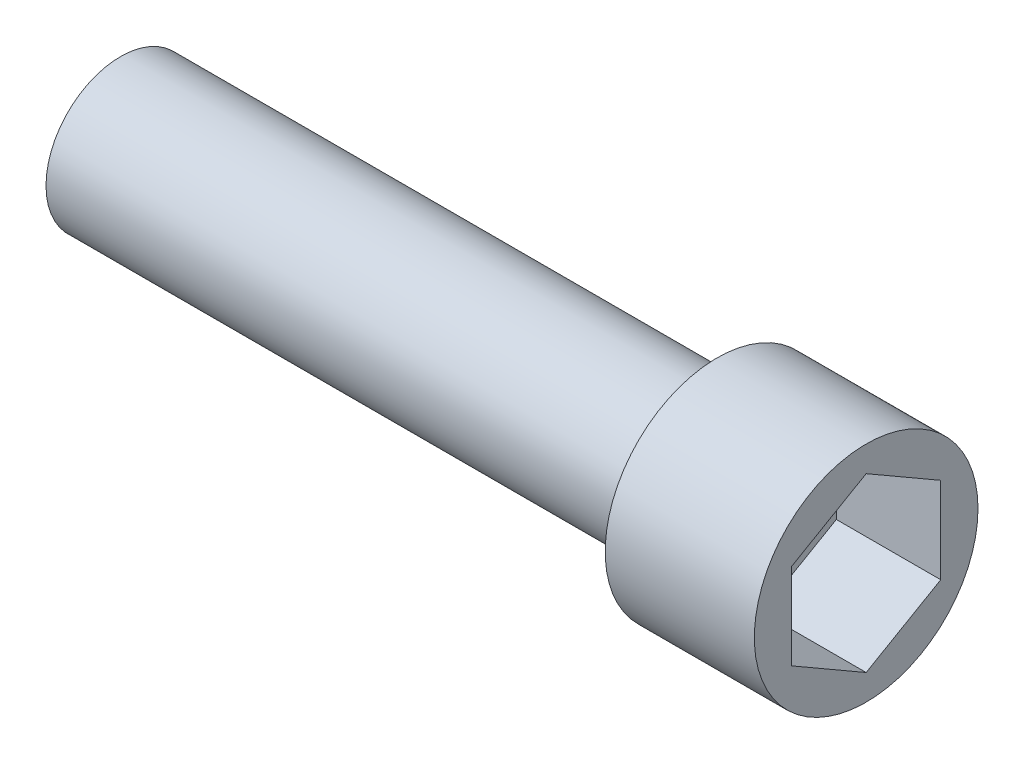
ISO-10303-21;
HEADER;
FILE_DESCRIPTION(('STEP AP214'),'2;1');
FILE_NAME('part.step','',(''),(''),'','','');
FILE_SCHEMA(('AUTOMOTIVE_DESIGN { 1 0 10303 214 1 1 1 1 }'));
ENDSEC;
DATA;
#1=APPLICATION_CONTEXT('core data for automotive mechanical design processes');
#2=APPLICATION_PROTOCOL_DEFINITION('international standard','automotive_design',2000,#1);
#3=PRODUCT_CONTEXT('',#1,'mechanical');
#4=PRODUCT('Part','Part','',(#3));
#5=PRODUCT_RELATED_PRODUCT_CATEGORY('part','',(#4));
#6=PRODUCT_DEFINITION_FORMATION('','',#4);
#7=PRODUCT_DEFINITION_CONTEXT('part definition',#1,'design');
#8=PRODUCT_DEFINITION('design','',#6,#7);
#9=PRODUCT_DEFINITION_SHAPE('','',#8);
#10=(LENGTH_UNIT() NAMED_UNIT(*) SI_UNIT(.MILLI.,.METRE.));
#11=(NAMED_UNIT(*) PLANE_ANGLE_UNIT() SI_UNIT($,.RADIAN.));
#12=(NAMED_UNIT(*) SI_UNIT($,.STERADIAN.) SOLID_ANGLE_UNIT());
#13=UNCERTAINTY_MEASURE_WITH_UNIT(LENGTH_MEASURE(1.E-05),#10,'distance_accuracy_value','');
#14=(GEOMETRIC_REPRESENTATION_CONTEXT(3) GLOBAL_UNCERTAINTY_ASSIGNED_CONTEXT((#13)) GLOBAL_UNIT_ASSIGNED_CONTEXT((#10,
#11,#12)) REPRESENTATION_CONTEXT('',''));
#15=CARTESIAN_POINT('',(0.,0.,0.));
#16=DIRECTION('',(0.,0.,1.));
#17=DIRECTION('',(1.,0.,0.));
#18=AXIS2_PLACEMENT_3D('',#15,#16,#17);
#19=CARTESIAN_POINT('',(10.,0.,0.));
#20=DIRECTION('',(-1.,0.,0.));
#21=DIRECTION('',(0.,0.,1.));
#22=AXIS2_PLACEMENT_3D('',#19,#20,#21);
#23=CYLINDRICAL_SURFACE('',#22,7.5);
#24=CARTESIAN_POINT('',(10.,0.,0.));
#25=DIRECTION('',(1.,0.,0.));
#26=DIRECTION('',(0.,0.,-1.));
#27=AXIS2_PLACEMENT_3D('',#24,#25,#26);
#28=CIRCLE('',#27,7.5);
#29=CARTESIAN_POINT('',(10.,0.,-7.5));
#30=VERTEX_POINT('',#29);
#31=EDGE_CURVE('E54',#30,#30,#28,.T.);
#32=ORIENTED_EDGE('',*,*,#31,.F.);
#33=EDGE_LOOP('',(#32));
#34=FACE_BOUND('',#33,.T.);
#35=CARTESIAN_POINT('',(0.,0.,0.));
#36=DIRECTION('',(1.,0.,0.));
#37=DIRECTION('',(0.,0.,-1.));
#38=AXIS2_PLACEMENT_3D('',#35,#36,#37);
#39=CIRCLE('',#38,7.5);
#40=CARTESIAN_POINT('',(0.,0.,-7.5));
#41=VERTEX_POINT('',#40);
#42=EDGE_CURVE('E48',#41,#41,#39,.T.);
#43=ORIENTED_EDGE('',*,*,#42,.T.);
#44=EDGE_LOOP('',(#43));
#45=FACE_BOUND('',#44,.T.);
#46=ADVANCED_FACE('F45',(#34,#45),#23,.T.);
#47=CARTESIAN_POINT('',(10.,0.,0.));
#48=DIRECTION('',(1.,0.,0.));
#49=DIRECTION('',(0.,0.,-1.));
#50=AXIS2_PLACEMENT_3D('',#47,#48,#49);
#51=PLANE('',#50);
#52=DIRECTION('',(0.,1.,0.));
#53=VECTOR('',#52,1.);
#54=CARTESIAN_POINT('',(10.,-2.88675134594813,-5.));
#55=LINE('',#54,#53);
#56=CARTESIAN_POINT('',(10.,-2.88675134594813,-5.));
#57=VERTEX_POINT('',#56);
#58=CARTESIAN_POINT('',(10.,2.88675134594813,-5.));
#59=VERTEX_POINT('',#58);
#60=EDGE_CURVE('E62',#57,#59,#55,.T.);
#61=ORIENTED_EDGE('',*,*,#60,.F.);
#62=DIRECTION('',(0.,0.5,-0.866025403784439));
#63=VECTOR('',#62,1.);
#64=CARTESIAN_POINT('',(10.,-5.77350269189626,0.));
#65=LINE('',#64,#63);
#66=CARTESIAN_POINT('',(10.,-5.77350269189626,0.));
#67=VERTEX_POINT('',#66);
#68=EDGE_CURVE('E156',#67,#57,#65,.T.);
#69=ORIENTED_EDGE('',*,*,#68,.F.);
#70=DIRECTION('',(0.,-0.5,-0.866025403784438));
#71=VECTOR('',#70,1.);
#72=CARTESIAN_POINT('',(10.,-2.88675134594813,5.));
#73=LINE('',#72,#71);
#74=CARTESIAN_POINT('',(10.,-2.88675134594813,5.));
#75=VERTEX_POINT('',#74);
#76=EDGE_CURVE('E153',#75,#67,#73,.T.);
#77=ORIENTED_EDGE('',*,*,#76,.F.);
#78=DIRECTION('',(0.,-1.,0.));
#79=VECTOR('',#78,1.);
#80=CARTESIAN_POINT('',(10.,2.88675134594813,5.));
#81=LINE('',#80,#79);
#82=CARTESIAN_POINT('',(10.,2.88675134594813,5.));
#83=VERTEX_POINT('',#82);
#84=EDGE_CURVE('E110',#83,#75,#81,.T.);
#85=ORIENTED_EDGE('',*,*,#84,.F.);
#86=DIRECTION('',(0.,-0.5,0.866025403784439));
#87=VECTOR('',#86,1.);
#88=CARTESIAN_POINT('',(10.,5.77350269189626,0.));
#89=LINE('',#88,#87);
#90=CARTESIAN_POINT('',(10.,5.77350269189626,0.));
#91=VERTEX_POINT('',#90);
#92=EDGE_CURVE('E147',#91,#83,#89,.T.);
#93=ORIENTED_EDGE('',*,*,#92,.F.);
#94=DIRECTION('',(0.,0.5,0.866025403784438));
#95=VECTOR('',#94,1.);
#96=CARTESIAN_POINT('',(10.,2.88675134594813,-5.));
#97=LINE('',#96,#95);
#98=EDGE_CURVE('E142',#59,#91,#97,.T.);
#99=ORIENTED_EDGE('',*,*,#98,.F.);
#100=EDGE_LOOP('',(#61,#69,#77,#85,#93,#99));
#101=FACE_BOUND('',#100,.T.);
#102=ORIENTED_EDGE('',*,*,#31,.T.);
#103=EDGE_LOOP('',(#102));
#104=FACE_BOUND('',#103,.T.);
#105=ADVANCED_FACE('F182',(#101,#104),#51,.T.);
#106=CARTESIAN_POINT('',(0.,0.,0.));
#107=DIRECTION('',(1.,0.,0.));
#108=DIRECTION('',(0.,0.,-1.));
#109=AXIS2_PLACEMENT_3D('',#106,#107,#108);
#110=PLANE('',#109);
#111=CARTESIAN_POINT('',(0.,0.,0.));
#112=DIRECTION('',(-1.,0.,0.));
#113=DIRECTION('',(0.,0.,1.));
#114=AXIS2_PLACEMENT_3D('',#111,#112,#113);
#115=CIRCLE('',#114,5.);
#116=CARTESIAN_POINT('',(0.,0.,5.));
#117=VERTEX_POINT('',#116);
#118=EDGE_CURVE('E11',#117,#117,#115,.T.);
#119=ORIENTED_EDGE('',*,*,#118,.F.);
#120=EDGE_LOOP('',(#119));
#121=FACE_BOUND('',#120,.T.);
#122=ORIENTED_EDGE('',*,*,#42,.F.);
#123=EDGE_LOOP('',(#122));
#124=FACE_BOUND('',#123,.T.);
#125=ADVANCED_FACE('F179',(#121,#124),#110,.F.);
#126=CARTESIAN_POINT('',(3.,-2.88675134594813,-5.));
#127=DIRECTION('',(0.,0.,-1.));
#128=DIRECTION('',(-1.,0.,0.));
#129=AXIS2_PLACEMENT_3D('',#126,#127,#128);
#130=PLANE('',#129);
#131=ORIENTED_EDGE('',*,*,#60,.T.);
#132=DIRECTION('',(1.,0.,0.));
#133=VECTOR('',#132,1.);
#134=CARTESIAN_POINT('',(3.,2.88675134594813,-5.));
#135=LINE('',#134,#133);
#136=CARTESIAN_POINT('',(3.,2.88675134594813,-5.));
#137=VERTEX_POINT('',#136);
#138=EDGE_CURVE('E92',#137,#59,#135,.T.);
#139=ORIENTED_EDGE('',*,*,#138,.F.);
#140=DIRECTION('',(0.,1.,0.));
#141=VECTOR('',#140,1.);
#142=CARTESIAN_POINT('',(3.,-2.88675134594813,-5.));
#143=LINE('',#142,#141);
#144=CARTESIAN_POINT('',(3.,-2.88675134594813,-5.));
#145=VERTEX_POINT('',#144);
#146=EDGE_CURVE('E159',#145,#137,#143,.T.);
#147=ORIENTED_EDGE('',*,*,#146,.F.);
#148=DIRECTION('',(1.,0.,0.));
#149=VECTOR('',#148,1.);
#150=CARTESIAN_POINT('',(3.,-2.88675134594813,-5.));
#151=LINE('',#150,#149);
#152=EDGE_CURVE('E70',#145,#57,#151,.T.);
#153=ORIENTED_EDGE('',*,*,#152,.T.);
#154=EDGE_LOOP('',(#131,#139,#147,#153));
#155=FACE_BOUND('',#154,.T.);
#156=ADVANCED_FACE('F181',(#155),#130,.F.);
#157=CARTESIAN_POINT('',(3.,-5.77350269189626,0.));
#158=DIRECTION('',(0.,-0.866025403784439,-0.5));
#159=DIRECTION('',(0.,0.5,-0.866025403784439));
#160=AXIS2_PLACEMENT_3D('',#157,#158,#159);
#161=PLANE('',#160);
#162=ORIENTED_EDGE('',*,*,#68,.T.);
#163=ORIENTED_EDGE('',*,*,#152,.F.);
#164=DIRECTION('',(0.,0.5,-0.866025403784439));
#165=VECTOR('',#164,1.);
#166=CARTESIAN_POINT('',(3.,-5.77350269189626,0.));
#167=LINE('',#166,#165);
#168=CARTESIAN_POINT('',(3.,-5.77350269189626,0.));
#169=VERTEX_POINT('',#168);
#170=EDGE_CURVE('E124',#169,#145,#167,.T.);
#171=ORIENTED_EDGE('',*,*,#170,.F.);
#172=DIRECTION('',(1.,0.,0.));
#173=VECTOR('',#172,1.);
#174=CARTESIAN_POINT('',(3.,-5.77350269189626,0.));
#175=LINE('',#174,#173);
#176=EDGE_CURVE('E115',#169,#67,#175,.T.);
#177=ORIENTED_EDGE('',*,*,#176,.T.);
#178=EDGE_LOOP('',(#162,#163,#171,#177));
#179=FACE_BOUND('',#178,.T.);
#180=ADVANCED_FACE('F189',(#179),#161,.F.);
#181=CARTESIAN_POINT('',(3.,-2.88675134594813,5.));
#182=DIRECTION('',(0.,-0.866025403784438,0.5));
#183=DIRECTION('',(0.,-0.5,-0.866025403784439));
#184=AXIS2_PLACEMENT_3D('',#181,#182,#183);
#185=PLANE('',#184);
#186=ORIENTED_EDGE('',*,*,#76,.T.);
#187=ORIENTED_EDGE('',*,*,#176,.F.);
#188=DIRECTION('',(0.,-0.5,-0.866025403784438));
#189=VECTOR('',#188,1.);
#190=CARTESIAN_POINT('',(3.,-2.88675134594813,5.));
#191=LINE('',#190,#189);
#192=CARTESIAN_POINT('',(3.,-2.88675134594813,5.));
#193=VERTEX_POINT('',#192);
#194=EDGE_CURVE('E119',#193,#169,#191,.T.);
#195=ORIENTED_EDGE('',*,*,#194,.F.);
#196=DIRECTION('',(1.,0.,0.));
#197=VECTOR('',#196,1.);
#198=CARTESIAN_POINT('',(3.,-2.88675134594813,5.));
#199=LINE('',#198,#197);
#200=EDGE_CURVE('E103',#193,#75,#199,.T.);
#201=ORIENTED_EDGE('',*,*,#200,.T.);
#202=EDGE_LOOP('',(#186,#187,#195,#201));
#203=FACE_BOUND('',#202,.T.);
#204=ADVANCED_FACE('F120',(#203),#185,.F.);
#205=CARTESIAN_POINT('',(3.,2.88675134594813,5.));
#206=DIRECTION('',(0.,0.,1.));
#207=DIRECTION('',(1.,0.,0.));
#208=AXIS2_PLACEMENT_3D('',#205,#206,#207);
#209=PLANE('',#208);
#210=ORIENTED_EDGE('',*,*,#84,.T.);
#211=ORIENTED_EDGE('',*,*,#200,.F.);
#212=DIRECTION('',(0.,-1.,0.));
#213=VECTOR('',#212,1.);
#214=CARTESIAN_POINT('',(3.,2.88675134594813,5.));
#215=LINE('',#214,#213);
#216=CARTESIAN_POINT('',(3.,2.88675134594813,5.));
#217=VERTEX_POINT('',#216);
#218=EDGE_CURVE('E107',#217,#193,#215,.T.);
#219=ORIENTED_EDGE('',*,*,#218,.F.);
#220=DIRECTION('',(1.,0.,0.));
#221=VECTOR('',#220,1.);
#222=CARTESIAN_POINT('',(3.,2.88675134594813,5.));
#223=LINE('',#222,#221);
#224=EDGE_CURVE('E116',#217,#83,#223,.T.);
#225=ORIENTED_EDGE('',*,*,#224,.T.);
#226=EDGE_LOOP('',(#210,#211,#219,#225));
#227=FACE_BOUND('',#226,.T.);
#228=ADVANCED_FACE('F105',(#227),#209,.F.);
#229=CARTESIAN_POINT('',(3.,5.77350269189626,0.));
#230=DIRECTION('',(0.,0.866025403784439,0.5));
#231=DIRECTION('',(0.,-0.5,0.866025403784439));
#232=AXIS2_PLACEMENT_3D('',#229,#230,#231);
#233=PLANE('',#232);
#234=ORIENTED_EDGE('',*,*,#92,.T.);
#235=ORIENTED_EDGE('',*,*,#224,.F.);
#236=DIRECTION('',(0.,-0.5,0.866025403784439));
#237=VECTOR('',#236,1.);
#238=CARTESIAN_POINT('',(3.,5.77350269189626,0.));
#239=LINE('',#238,#237);
#240=CARTESIAN_POINT('',(3.,5.77350269189626,0.));
#241=VERTEX_POINT('',#240);
#242=EDGE_CURVE('E130',#241,#217,#239,.T.);
#243=ORIENTED_EDGE('',*,*,#242,.F.);
#244=DIRECTION('',(1.,0.,0.));
#245=VECTOR('',#244,1.);
#246=CARTESIAN_POINT('',(3.,5.77350269189626,0.));
#247=LINE('',#246,#245);
#248=EDGE_CURVE('E166',#241,#91,#247,.T.);
#249=ORIENTED_EDGE('',*,*,#248,.T.);
#250=EDGE_LOOP('',(#234,#235,#243,#249));
#251=FACE_BOUND('',#250,.T.);
#252=ADVANCED_FACE('F230',(#251),#233,.F.);
#253=CARTESIAN_POINT('',(3.,2.88675134594813,-5.));
#254=DIRECTION('',(0.,0.866025403784438,-0.5));
#255=DIRECTION('',(0.,0.5,0.866025403784439));
#256=AXIS2_PLACEMENT_3D('',#253,#254,#255);
#257=PLANE('',#256);
#258=ORIENTED_EDGE('',*,*,#98,.T.);
#259=ORIENTED_EDGE('',*,*,#248,.F.);
#260=DIRECTION('',(0.,0.5,0.866025403784438));
#261=VECTOR('',#260,1.);
#262=CARTESIAN_POINT('',(3.,2.88675134594813,-5.));
#263=LINE('',#262,#261);
#264=EDGE_CURVE('E134',#137,#241,#263,.T.);
#265=ORIENTED_EDGE('',*,*,#264,.F.);
#266=ORIENTED_EDGE('',*,*,#138,.T.);
#267=EDGE_LOOP('',(#258,#259,#265,#266));
#268=FACE_BOUND('',#267,.T.);
#269=ADVANCED_FACE('F238',(#268),#257,.F.);
#270=CARTESIAN_POINT('',(3.,0.,0.));
#271=DIRECTION('',(1.,0.,0.));
#272=DIRECTION('',(0.,0.,-1.));
#273=AXIS2_PLACEMENT_3D('',#270,#271,#272);
#274=PLANE('',#273);
#275=ORIENTED_EDGE('',*,*,#146,.T.);
#276=ORIENTED_EDGE('',*,*,#264,.T.);
#277=ORIENTED_EDGE('',*,*,#242,.T.);
#278=ORIENTED_EDGE('',*,*,#218,.T.);
#279=ORIENTED_EDGE('',*,*,#194,.T.);
#280=ORIENTED_EDGE('',*,*,#170,.T.);
#281=EDGE_LOOP('',(#275,#276,#277,#278,#279,#280));
#282=FACE_BOUND('',#281,.T.);
#283=ADVANCED_FACE('F127',(#282),#274,.T.);
#284=CARTESIAN_POINT('',(-40.,0.,0.));
#285=DIRECTION('',(1.,0.,0.));
#286=DIRECTION('',(0.,0.,-1.));
#287=AXIS2_PLACEMENT_3D('',#284,#285,#286);
#288=CYLINDRICAL_SURFACE('',#287,5.);
#289=CARTESIAN_POINT('',(-40.,0.,0.));
#290=DIRECTION('',(-1.,0.,0.));
#291=DIRECTION('',(0.,0.,1.));
#292=AXIS2_PLACEMENT_3D('',#289,#290,#291);
#293=CIRCLE('',#292,5.);
#294=CARTESIAN_POINT('',(-40.,0.,5.));
#295=VERTEX_POINT('',#294);
#296=EDGE_CURVE('E143',#295,#295,#293,.T.);
#297=ORIENTED_EDGE('',*,*,#296,.F.);
#298=EDGE_LOOP('',(#297));
#299=FACE_BOUND('',#298,.T.);
#300=ORIENTED_EDGE('',*,*,#118,.T.);
#301=EDGE_LOOP('',(#300));
#302=FACE_BOUND('',#301,.T.);
#303=ADVANCED_FACE('F253',(#299,#302),#288,.T.);
#304=CARTESIAN_POINT('',(-40.,0.,0.));
#305=DIRECTION('',(-1.,0.,0.));
#306=DIRECTION('',(0.,0.,1.));
#307=AXIS2_PLACEMENT_3D('',#304,#305,#306);
#308=PLANE('',#307);
#309=ORIENTED_EDGE('',*,*,#296,.T.);
#310=EDGE_LOOP('',(#309));
#311=FACE_BOUND('',#310,.T.);
#312=ADVANCED_FACE('F264',(#311),#308,.T.);
#313=CLOSED_SHELL('',(#46,#105,#125,#156,#180,#204,#228,#252,#269,#283,#303,#312));
#314=MANIFOLD_SOLID_BREP('B2',#313);
#315=ADVANCED_BREP_SHAPE_REPRESENTATION('',(#18,#314),#14);
#316=SHAPE_DEFINITION_REPRESENTATION(#9,#315);
ENDSEC;
END-ISO-10303-21;
